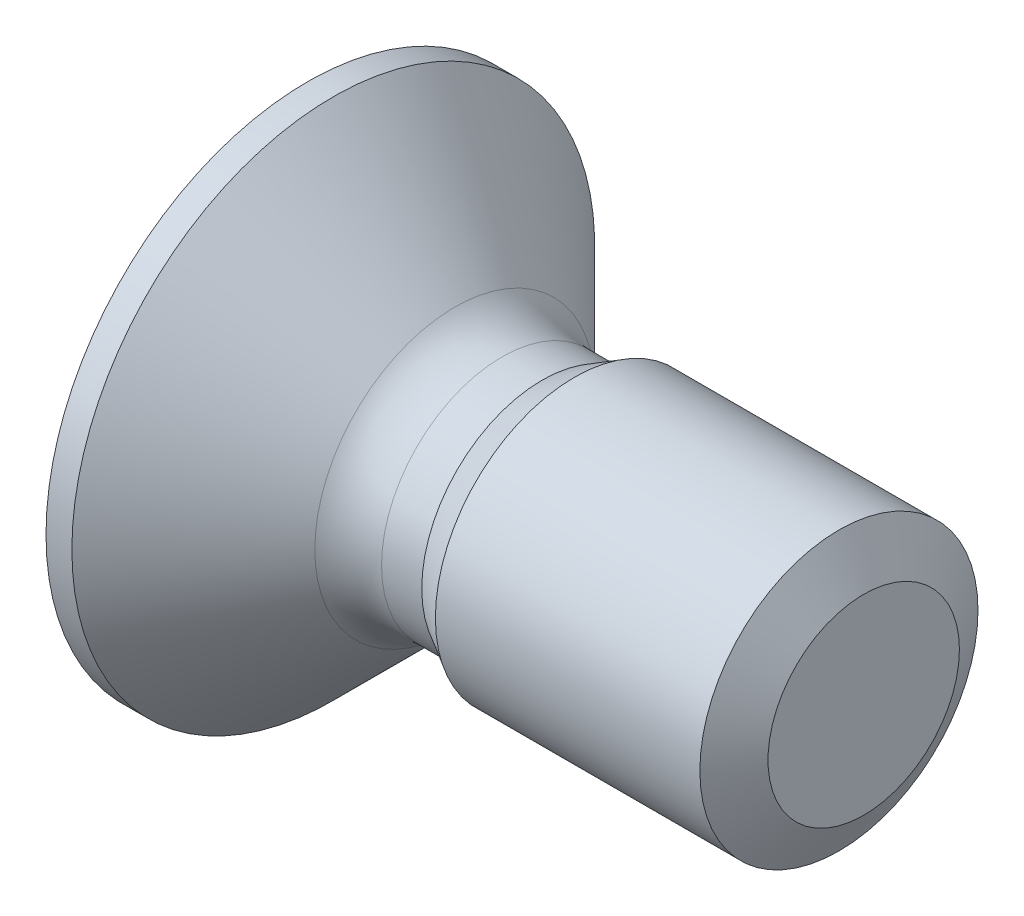
ISO-10303-21;
HEADER;
FILE_DESCRIPTION(('STEP AP214'),'2;1');
FILE_NAME('part.step','',(''),(''),'','','');
FILE_SCHEMA(('AUTOMOTIVE_DESIGN { 1 0 10303 214 1 1 1 1 }'));
ENDSEC;
DATA;
#1=APPLICATION_CONTEXT('core data for automotive mechanical design processes');
#2=APPLICATION_PROTOCOL_DEFINITION('international standard','automotive_design',2000,#1);
#3=PRODUCT_CONTEXT('',#1,'mechanical');
#4=PRODUCT('Part','Part','',(#3));
#5=PRODUCT_RELATED_PRODUCT_CATEGORY('part','',(#4));
#6=PRODUCT_DEFINITION_FORMATION('','',#4);
#7=PRODUCT_DEFINITION_CONTEXT('part definition',#1,'design');
#8=PRODUCT_DEFINITION('design','',#6,#7);
#9=PRODUCT_DEFINITION_SHAPE('','',#8);
#10=(LENGTH_UNIT() NAMED_UNIT(*) SI_UNIT(.MILLI.,.METRE.));
#11=(NAMED_UNIT(*) PLANE_ANGLE_UNIT() SI_UNIT($,.RADIAN.));
#12=(NAMED_UNIT(*) SI_UNIT($,.STERADIAN.) SOLID_ANGLE_UNIT());
#13=UNCERTAINTY_MEASURE_WITH_UNIT(LENGTH_MEASURE(1.E-05),#10,'distance_accuracy_value','');
#14=(GEOMETRIC_REPRESENTATION_CONTEXT(3) GLOBAL_UNCERTAINTY_ASSIGNED_CONTEXT((#13)) GLOBAL_UNIT_ASSIGNED_CONTEXT((#10,
#11,#12)) REPRESENTATION_CONTEXT('',''));
#15=CARTESIAN_POINT('',(0.,0.,0.));
#16=DIRECTION('',(0.,0.,1.));
#17=DIRECTION('',(1.,0.,0.));
#18=AXIS2_PLACEMENT_3D('',#15,#16,#17);
#19=CARTESIAN_POINT('',(0.,0.,0.));
#20=DIRECTION('',(1.,0.,0.));
#21=DIRECTION('',(0.,0.,-1.));
#22=AXIS2_PLACEMENT_3D('',#19,#20,#21);
#23=PLANE('',#22);
#24=CARTESIAN_POINT('',(0.,0.,0.));
#25=DIRECTION('',(-1.,0.,0.));
#26=DIRECTION('',(0.,0.,1.));
#27=AXIS2_PLACEMENT_3D('',#24,#25,#26);
#28=CIRCLE('',#27,2.35);
#29=CARTESIAN_POINT('',(0.,0.,2.35));
#30=VERTEX_POINT('',#29);
#31=EDGE_CURVE('E183',#30,#30,#28,.T.);
#32=ORIENTED_EDGE('',*,*,#31,.T.);
#33=EDGE_LOOP('',(#32));
#34=FACE_BOUND('',#33,.T.);
#35=DIRECTION('',(0.,1.,0.));
#36=VECTOR('',#35,1.);
#37=CARTESIAN_POINT('',(0.,1.45,0.225000000000005));
#38=LINE('',#37,#36);
#39=CARTESIAN_POINT('',(0.,0.225,0.225000000000001));
#40=VERTEX_POINT('',#39);
#41=CARTESIAN_POINT('',(0.,1.45,0.225000000000005));
#42=VERTEX_POINT('',#41);
#43=EDGE_CURVE('E105',#40,#42,#38,.T.);
#44=ORIENTED_EDGE('',*,*,#43,.F.);
#45=DIRECTION('',(0.,0.,-1.));
#46=VECTOR('',#45,1.);
#47=CARTESIAN_POINT('',(0.,0.225,-1.45));
#48=LINE('',#47,#46);
#49=CARTESIAN_POINT('',(0.,0.225,1.45));
#50=VERTEX_POINT('',#49);
#51=EDGE_CURVE('E150',#50,#40,#48,.T.);
#52=ORIENTED_EDGE('',*,*,#51,.F.);
#53=DIRECTION('',(0.,1.,0.));
#54=VECTOR('',#53,1.);
#55=CARTESIAN_POINT('',(0.,0.225,1.45));
#56=LINE('',#55,#54);
#57=CARTESIAN_POINT('',(0.,-0.225,1.45));
#58=VERTEX_POINT('',#57);
#59=EDGE_CURVE('E147',#58,#50,#56,.T.);
#60=ORIENTED_EDGE('',*,*,#59,.F.);
#61=DIRECTION('',(0.,0.,1.));
#62=VECTOR('',#61,1.);
#63=CARTESIAN_POINT('',(0.,-0.225,-1.45));
#64=LINE('',#63,#62);
#65=CARTESIAN_POINT('',(0.,-0.225,0.224999999999999));
#66=VERTEX_POINT('',#65);
#67=EDGE_CURVE('E78',#66,#58,#64,.T.);
#68=ORIENTED_EDGE('',*,*,#67,.F.);
#69=CARTESIAN_POINT('',(0.,-1.45,0.224999999999995));
#70=VERTEX_POINT('',#69);
#71=EDGE_CURVE('E113',#70,#66,#38,.T.);
#72=ORIENTED_EDGE('',*,*,#71,.F.);
#73=DIRECTION('',(0.,0.,1.));
#74=VECTOR('',#73,1.);
#75=CARTESIAN_POINT('',(0.,-1.45,0.224999999999995));
#76=LINE('',#75,#74);
#77=CARTESIAN_POINT('',(0.,-1.45,-0.225000000000005));
#78=VERTEX_POINT('',#77);
#79=EDGE_CURVE('E114',#78,#70,#76,.T.);
#80=ORIENTED_EDGE('',*,*,#79,.F.);
#81=DIRECTION('',(0.,-1.,0.));
#82=VECTOR('',#81,1.);
#83=CARTESIAN_POINT('',(0.,1.45,-0.224999999999995));
#84=LINE('',#83,#82);
#85=CARTESIAN_POINT('',(0.,-0.225,-0.225000000000001));
#86=VERTEX_POINT('',#85);
#87=EDGE_CURVE('E127',#86,#78,#84,.T.);
#88=ORIENTED_EDGE('',*,*,#87,.F.);
#89=CARTESIAN_POINT('',(0.,-0.225,-1.45));
#90=VERTEX_POINT('',#89);
#91=EDGE_CURVE('E144',#90,#86,#64,.T.);
#92=ORIENTED_EDGE('',*,*,#91,.F.);
#93=DIRECTION('',(0.,-1.,0.));
#94=VECTOR('',#93,1.);
#95=CARTESIAN_POINT('',(0.,0.225,-1.45));
#96=LINE('',#95,#94);
#97=CARTESIAN_POINT('',(0.,0.225,-1.45));
#98=VERTEX_POINT('',#97);
#99=EDGE_CURVE('E55',#98,#90,#96,.T.);
#100=ORIENTED_EDGE('',*,*,#99,.F.);
#101=CARTESIAN_POINT('',(0.,0.225,-0.224999999999999));
#102=VERTEX_POINT('',#101);
#103=EDGE_CURVE('E153',#102,#98,#48,.T.);
#104=ORIENTED_EDGE('',*,*,#103,.F.);
#105=CARTESIAN_POINT('',(0.,1.45,-0.224999999999995));
#106=VERTEX_POINT('',#105);
#107=EDGE_CURVE('E126',#106,#102,#84,.T.);
#108=ORIENTED_EDGE('',*,*,#107,.F.);
#109=DIRECTION('',(0.,0.,-1.));
#110=VECTOR('',#109,1.);
#111=CARTESIAN_POINT('',(0.,1.45,0.225000000000005));
#112=LINE('',#111,#110);
#113=EDGE_CURVE('E119',#42,#106,#112,.T.);
#114=ORIENTED_EDGE('',*,*,#113,.F.);
#115=EDGE_LOOP('',(#44,#52,#60,#68,#72,#80,#88,#92,#100,#104,#108,#114));
#116=FACE_BOUND('',#115,.T.);
#117=ADVANCED_FACE('F41',(#34,#116),#23,.F.);
#118=CARTESIAN_POINT('',(1.8,0.,0.));
#119=DIRECTION('',(-0.124034734589208,-0.992277876713668,0.));
#120=DIRECTION('',(0.992277876713668,-0.124034734589208,0.));
#121=AXIS2_PLACEMENT_3D('',#118,#119,#120);
#122=PLANE('',#121);
#123=ORIENTED_EDGE('',*,*,#51,.T.);
#124=DIRECTION('',(0.984731927834662,-0.123091490979333,-0.123091490979333));
#125=VECTOR('',#124,1.);
#126=CARTESIAN_POINT('',(1.8,0.,0.));
#127=LINE('',#126,#125);
#128=CARTESIAN_POINT('',(1.8,0.,0.));
#129=VERTEX_POINT('',#128);
#130=EDGE_CURVE('E84',#40,#129,#127,.T.);
#131=ORIENTED_EDGE('',*,*,#130,.T.);
#132=DIRECTION('',(0.775090228729781,-0.0968862785912226,-0.624378239810101));
#133=VECTOR('',#132,1.);
#134=CARTESIAN_POINT('',(0.,0.225,1.45));
#135=LINE('',#134,#133);
#136=EDGE_CURVE('E64',#50,#129,#135,.T.);
#137=ORIENTED_EDGE('',*,*,#136,.F.);
#138=EDGE_LOOP('',(#123,#131,#137));
#139=FACE_BOUND('',#138,.T.);
#140=ADVANCED_FACE('F199',(#139),#122,.T.);
#141=DIRECTION('',(0.775090228729781,-0.0968862785912226,0.624378239810101));
#142=VECTOR('',#141,1.);
#143=CARTESIAN_POINT('',(0.,0.225,-1.45));
#144=LINE('',#143,#142);
#145=EDGE_CURVE('E149',#98,#129,#144,.T.);
#146=ORIENTED_EDGE('',*,*,#145,.T.);
#147=DIRECTION('',(-0.984731927834662,0.123091490979333,-0.123091490979332));
#148=VECTOR('',#147,1.);
#149=CARTESIAN_POINT('',(1.8,0.,0.));
#150=LINE('',#149,#148);
#151=EDGE_CURVE('E131',#129,#102,#150,.T.);
#152=ORIENTED_EDGE('',*,*,#151,.T.);
#153=ORIENTED_EDGE('',*,*,#103,.T.);
#154=EDGE_LOOP('',(#146,#152,#153));
#155=FACE_BOUND('',#154,.T.);
#156=ADVANCED_FACE('F193',(#155),#122,.T.);
#157=CARTESIAN_POINT('',(1.8,0.,0.));
#158=DIRECTION('',(-0.124034734589208,0.992277876713668,0.));
#159=DIRECTION('',(-0.992277876713668,-0.124034734589208,0.));
#160=AXIS2_PLACEMENT_3D('',#157,#158,#159);
#161=PLANE('',#160);
#162=DIRECTION('',(0.775090228729781,0.0968862785912226,-0.624378239810101));
#163=VECTOR('',#162,1.);
#164=CARTESIAN_POINT('',(0.,-0.225,1.45));
#165=LINE('',#164,#163);
#166=EDGE_CURVE('E143',#58,#129,#165,.T.);
#167=ORIENTED_EDGE('',*,*,#166,.T.);
#168=DIRECTION('',(-0.984731927834662,-0.123091490979333,0.123091490979332));
#169=VECTOR('',#168,1.);
#170=CARTESIAN_POINT('',(1.8,0.,0.));
#171=LINE('',#170,#169);
#172=EDGE_CURVE('E11',#129,#66,#171,.T.);
#173=ORIENTED_EDGE('',*,*,#172,.T.);
#174=ORIENTED_EDGE('',*,*,#67,.T.);
#175=EDGE_LOOP('',(#167,#173,#174));
#176=FACE_BOUND('',#175,.T.);
#177=ADVANCED_FACE('F194',(#176),#161,.T.);
#178=ORIENTED_EDGE('',*,*,#91,.T.);
#179=DIRECTION('',(0.984731927834662,0.123091490979333,0.123091490979333));
#180=VECTOR('',#179,1.);
#181=CARTESIAN_POINT('',(1.8,0.,0.));
#182=LINE('',#181,#180);
#183=EDGE_CURVE('E48',#86,#129,#182,.T.);
#184=ORIENTED_EDGE('',*,*,#183,.T.);
#185=DIRECTION('',(0.775090228729781,0.0968862785912226,0.624378239810101));
#186=VECTOR('',#185,1.);
#187=CARTESIAN_POINT('',(0.,-0.225,-1.45));
#188=LINE('',#187,#186);
#189=EDGE_CURVE('E158',#90,#129,#188,.T.);
#190=ORIENTED_EDGE('',*,*,#189,.F.);
#191=EDGE_LOOP('',(#178,#184,#190));
#192=FACE_BOUND('',#191,.T.);
#193=ADVANCED_FACE('F187',(#192),#161,.T.);
#194=CARTESIAN_POINT('',(0.,0.,0.));
#195=DIRECTION('',(-1.,0.,0.));
#196=DIRECTION('',(0.,0.,1.));
#197=AXIS2_PLACEMENT_3D('',#194,#195,#196);
#198=CYLINDRICAL_SURFACE('',#197,2.35);
#199=ORIENTED_EDGE('',*,*,#31,.F.);
#200=EDGE_LOOP('',(#199));
#201=FACE_BOUND('',#200,.T.);
#202=CARTESIAN_POINT('',(0.232500000000005,0.,0.));
#203=DIRECTION('',(-1.,0.,0.));
#204=DIRECTION('',(0.,0.,1.));
#205=AXIS2_PLACEMENT_3D('',#202,#203,#204);
#206=CIRCLE('',#205,2.35);
#207=CARTESIAN_POINT('',(0.232500000000005,0.,2.35));
#208=VERTEX_POINT('',#207);
#209=EDGE_CURVE('E179',#208,#208,#206,.T.);
#210=ORIENTED_EDGE('',*,*,#209,.T.);
#211=EDGE_LOOP('',(#210));
#212=FACE_BOUND('',#211,.T.);
#213=ADVANCED_FACE('F227',(#201,#212),#198,.T.);
#214=CARTESIAN_POINT('',(1.32426406871193,0.,0.));
#215=DIRECTION('',(-1.,0.,0.));
#216=DIRECTION('',(0.,0.,1.));
#217=AXIS2_PLACEMENT_3D('',#214,#215,#216);
#218=CONICAL_SURFACE('',#217,1.25823593128807,0.78539816339745);
#219=ORIENTED_EDGE('',*,*,#209,.F.);
#220=EDGE_LOOP('',(#219));
#221=FACE_BOUND('',#220,.T.);
#222=CARTESIAN_POINT('',(1.32426406871193,0.,0.));
#223=DIRECTION('',(-1.,0.,0.));
#224=DIRECTION('',(0.,0.,1.));
#225=AXIS2_PLACEMENT_3D('',#222,#223,#224);
#226=CIRCLE('',#225,1.25823593128807);
#227=CARTESIAN_POINT('',(1.32426406871193,0.,1.25823593128807));
#228=VERTEX_POINT('',#227);
#229=EDGE_CURVE('E175',#228,#228,#226,.T.);
#230=ORIENTED_EDGE('',*,*,#229,.T.);
#231=EDGE_LOOP('',(#230));
#232=FACE_BOUND('',#231,.T.);
#233=ADVANCED_FACE('F230',(#221,#232),#218,.T.);
#234=CARTESIAN_POINT('',(1.74852813742386,0.,0.));
#235=DIRECTION('',(-1.,0.,0.));
#236=DIRECTION('',(0.,0.,1.));
#237=AXIS2_PLACEMENT_3D('',#234,#235,#236);
#238=TOROIDAL_SURFACE('',#237,1.6825,0.6);
#239=ORIENTED_EDGE('',*,*,#229,.F.);
#240=EDGE_LOOP('',(#239));
#241=FACE_BOUND('',#240,.T.);
#242=CARTESIAN_POINT('',(1.74852813742386,0.,0.));
#243=DIRECTION('',(-1.,0.,0.));
#244=DIRECTION('',(0.,0.,1.));
#245=AXIS2_PLACEMENT_3D('',#242,#243,#244);
#246=CIRCLE('',#245,1.0825);
#247=CARTESIAN_POINT('',(1.74852813742386,0.,1.0825));
#248=VERTEX_POINT('',#247);
#249=EDGE_CURVE('E172',#248,#248,#246,.T.);
#250=ORIENTED_EDGE('',*,*,#249,.T.);
#251=EDGE_LOOP('',(#250));
#252=FACE_BOUND('',#251,.T.);
#253=ADVANCED_FACE('F235',(#241,#252),#238,.F.);
#254=CARTESIAN_POINT('',(0.,0.,0.));
#255=DIRECTION('',(-1.,0.,0.));
#256=DIRECTION('',(0.,0.,1.));
#257=AXIS2_PLACEMENT_3D('',#254,#255,#256);
#258=CYLINDRICAL_SURFACE('',#257,1.0825);
#259=ORIENTED_EDGE('',*,*,#249,.F.);
#260=EDGE_LOOP('',(#259));
#261=FACE_BOUND('',#260,.T.);
#262=CARTESIAN_POINT('',(2.10988148973221,0.,0.));
#263=DIRECTION('',(-1.,0.,0.));
#264=DIRECTION('',(0.,0.,1.));
#265=AXIS2_PLACEMENT_3D('',#262,#263,#264);
#266=CIRCLE('',#265,1.0825);
#267=CARTESIAN_POINT('',(2.10988148973221,0.,1.0825));
#268=VERTEX_POINT('',#267);
#269=EDGE_CURVE('E169',#268,#268,#266,.T.);
#270=ORIENTED_EDGE('',*,*,#269,.T.);
#271=EDGE_LOOP('',(#270));
#272=FACE_BOUND('',#271,.T.);
#273=ADVANCED_FACE('F241',(#261,#272),#258,.T.);
#274=CARTESIAN_POINT('',(2.4,0.,0.));
#275=DIRECTION('',(1.,0.,0.));
#276=DIRECTION('',(0.,0.,-1.));
#277=AXIS2_PLACEMENT_3D('',#274,#275,#276);
#278=CONICAL_SURFACE('',#277,1.25,0.5235987755983);
#279=ORIENTED_EDGE('',*,*,#269,.F.);
#280=EDGE_LOOP('',(#279));
#281=FACE_BOUND('',#280,.T.);
#282=CARTESIAN_POINT('',(2.4,0.,0.));
#283=DIRECTION('',(-1.,0.,0.));
#284=DIRECTION('',(0.,0.,1.));
#285=AXIS2_PLACEMENT_3D('',#282,#283,#284);
#286=CIRCLE('',#285,1.25);
#287=CARTESIAN_POINT('',(2.4,0.,1.25));
#288=VERTEX_POINT('',#287);
#289=EDGE_CURVE('E166',#288,#288,#286,.T.);
#290=ORIENTED_EDGE('',*,*,#289,.T.);
#291=EDGE_LOOP('',(#290));
#292=FACE_BOUND('',#291,.T.);
#293=ADVANCED_FACE('F247',(#281,#292),#278,.T.);
#294=CARTESIAN_POINT('',(0.,0.,0.));
#295=DIRECTION('',(-1.,0.,0.));
#296=DIRECTION('',(0.,0.,1.));
#297=AXIS2_PLACEMENT_3D('',#294,#295,#296);
#298=CYLINDRICAL_SURFACE('',#297,1.25);
#299=CARTESIAN_POINT('',(4.77743720258411,0.,0.));
#300=DIRECTION('',(1.,0.,0.));
#301=DIRECTION('',(0.,0.,-1.));
#302=AXIS2_PLACEMENT_3D('',#299,#300,#301);
#303=CIRCLE('',#302,1.25);
#304=CARTESIAN_POINT('',(4.77743720258411,0.,-1.25));
#305=VERTEX_POINT('',#304);
#306=EDGE_CURVE('E163',#305,#305,#303,.T.);
#307=ORIENTED_EDGE('',*,*,#306,.F.);
#308=EDGE_LOOP('',(#307));
#309=FACE_BOUND('',#308,.T.);
#310=ORIENTED_EDGE('',*,*,#289,.F.);
#311=EDGE_LOOP('',(#310));
#312=FACE_BOUND('',#311,.T.);
#313=ADVANCED_FACE('F253',(#309,#312),#298,.T.);
#314=CARTESIAN_POINT('',(4.77743720258411,0.,0.));
#315=DIRECTION('',(-1.,0.,0.));
#316=DIRECTION('',(0.,0.,1.));
#317=AXIS2_PLACEMENT_3D('',#314,#315,#316);
#318=CONICAL_SURFACE('',#317,1.25,1.05188801855134);
#319=CARTESIAN_POINT('',(5.,0.,0.));
#320=DIRECTION('',(1.,0.,0.));
#321=DIRECTION('',(0.,0.,-1.));
#322=AXIS2_PLACEMENT_3D('',#319,#320,#321);
#323=CIRCLE('',#322,0.8603);
#324=CARTESIAN_POINT('',(5.,0.,-0.8603));
#325=VERTEX_POINT('',#324);
#326=EDGE_CURVE('E152',#325,#325,#323,.T.);
#327=ORIENTED_EDGE('',*,*,#326,.F.);
#328=EDGE_LOOP('',(#327));
#329=FACE_BOUND('',#328,.T.);
#330=ORIENTED_EDGE('',*,*,#306,.T.);
#331=EDGE_LOOP('',(#330));
#332=FACE_BOUND('',#331,.T.);
#333=ADVANCED_FACE('F258',(#329,#332),#318,.T.);
#334=CARTESIAN_POINT('',(5.,1.25,0.));
#335=DIRECTION('',(-1.,0.,0.));
#336=DIRECTION('',(0.,0.,1.));
#337=AXIS2_PLACEMENT_3D('',#334,#335,#336);
#338=PLANE('',#337);
#339=ORIENTED_EDGE('',*,*,#326,.T.);
#340=EDGE_LOOP('',(#339));
#341=FACE_BOUND('',#340,.T.);
#342=ADVANCED_FACE('F264',(#341),#338,.F.);
#343=CARTESIAN_POINT('',(0.,0.225,-1.45));
#344=DIRECTION('',(0.627329537872645,0.,-0.778753909083283));
#345=DIRECTION('',(-0.778753909083283,0.,-0.627329537872645));
#346=AXIS2_PLACEMENT_3D('',#343,#344,#345);
#347=PLANE('',#346);
#348=ORIENTED_EDGE('',*,*,#145,.F.);
#349=ORIENTED_EDGE('',*,*,#99,.T.);
#350=ORIENTED_EDGE('',*,*,#189,.T.);
#351=EDGE_LOOP('',(#348,#349,#350));
#352=FACE_BOUND('',#351,.T.);
#353=ADVANCED_FACE('F191',(#352),#347,.F.);
#354=CARTESIAN_POINT('',(0.,-0.225,1.45));
#355=DIRECTION('',(0.627329537872645,0.,0.778753909083283));
#356=DIRECTION('',(0.778753909083283,0.,-0.627329537872645));
#357=AXIS2_PLACEMENT_3D('',#354,#355,#356);
#358=PLANE('',#357);
#359=ORIENTED_EDGE('',*,*,#166,.F.);
#360=ORIENTED_EDGE('',*,*,#59,.T.);
#361=ORIENTED_EDGE('',*,*,#136,.T.);
#362=EDGE_LOOP('',(#359,#360,#361));
#363=FACE_BOUND('',#362,.T.);
#364=ADVANCED_FACE('F198',(#363),#358,.F.);
#365=CARTESIAN_POINT('',(1.8,0.,0.));
#366=DIRECTION('',(-0.124034734589208,0.,-0.992277876713668));
#367=DIRECTION('',(0.992277876713668,0.,-0.124034734589208));
#368=AXIS2_PLACEMENT_3D('',#365,#366,#367);
#369=PLANE('',#368);
#370=DIRECTION('',(0.775090228729781,0.624378239810101,-0.0968862785912204));
#371=VECTOR('',#370,1.);
#372=CARTESIAN_POINT('',(0.,-1.45,0.224999999999995));
#373=LINE('',#372,#371);
#374=EDGE_CURVE('E123',#70,#129,#373,.T.);
#375=ORIENTED_EDGE('',*,*,#374,.F.);
#376=ORIENTED_EDGE('',*,*,#71,.T.);
#377=ORIENTED_EDGE('',*,*,#172,.F.);
#378=EDGE_LOOP('',(#375,#376,#377));
#379=FACE_BOUND('',#378,.T.);
#380=ADVANCED_FACE('F203',(#379),#369,.T.);
#381=CARTESIAN_POINT('',(1.8,0.,0.));
#382=DIRECTION('',(-0.124034734589208,0.,0.992277876713668));
#383=DIRECTION('',(-0.992277876713668,0.,-0.124034734589208));
#384=AXIS2_PLACEMENT_3D('',#381,#382,#383);
#385=PLANE('',#384);
#386=ORIENTED_EDGE('',*,*,#87,.T.);
#387=DIRECTION('',(0.775090228729781,0.624378239810101,0.0968862785912248));
#388=VECTOR('',#387,1.);
#389=CARTESIAN_POINT('',(0.,-1.45,-0.225000000000005));
#390=LINE('',#389,#388);
#391=EDGE_CURVE('E137',#78,#129,#390,.T.);
#392=ORIENTED_EDGE('',*,*,#391,.T.);
#393=ORIENTED_EDGE('',*,*,#183,.F.);
#394=EDGE_LOOP('',(#386,#392,#393));
#395=FACE_BOUND('',#394,.T.);
#396=ADVANCED_FACE('F207',(#395),#385,.T.);
#397=CARTESIAN_POINT('',(0.,-1.45,-0.225000000000005));
#398=DIRECTION('',(0.627329537872645,-0.778753909083283,0.));
#399=DIRECTION('',(0.778753909083283,0.627329537872645,0.));
#400=AXIS2_PLACEMENT_3D('',#397,#398,#399);
#401=PLANE('',#400);
#402=ORIENTED_EDGE('',*,*,#391,.F.);
#403=ORIENTED_EDGE('',*,*,#79,.T.);
#404=ORIENTED_EDGE('',*,*,#374,.T.);
#405=EDGE_LOOP('',(#402,#403,#404));
#406=FACE_BOUND('',#405,.T.);
#407=ADVANCED_FACE('F206',(#406),#401,.F.);
#408=ORIENTED_EDGE('',*,*,#43,.T.);
#409=DIRECTION('',(0.775090228729781,-0.624378239810101,-0.0968862785912248));
#410=VECTOR('',#409,1.);
#411=CARTESIAN_POINT('',(0.,1.45,0.225000000000005));
#412=LINE('',#411,#410);
#413=EDGE_CURVE('E108',#42,#129,#412,.T.);
#414=ORIENTED_EDGE('',*,*,#413,.T.);
#415=ORIENTED_EDGE('',*,*,#130,.F.);
#416=EDGE_LOOP('',(#408,#414,#415));
#417=FACE_BOUND('',#416,.T.);
#418=ADVANCED_FACE('F107',(#417),#369,.T.);
#419=DIRECTION('',(0.775090228729781,-0.624378239810101,0.0968862785912204));
#420=VECTOR('',#419,1.);
#421=CARTESIAN_POINT('',(0.,1.45,-0.224999999999995));
#422=LINE('',#421,#420);
#423=EDGE_CURVE('E121',#106,#129,#422,.T.);
#424=ORIENTED_EDGE('',*,*,#423,.F.);
#425=ORIENTED_EDGE('',*,*,#107,.T.);
#426=ORIENTED_EDGE('',*,*,#151,.F.);
#427=EDGE_LOOP('',(#424,#425,#426));
#428=FACE_BOUND('',#427,.T.);
#429=ADVANCED_FACE('F210',(#428),#385,.T.);
#430=CARTESIAN_POINT('',(0.,1.45,0.225000000000005));
#431=DIRECTION('',(0.627329537872645,0.778753909083283,0.));
#432=DIRECTION('',(-0.778753909083283,0.627329537872645,0.));
#433=AXIS2_PLACEMENT_3D('',#430,#431,#432);
#434=PLANE('',#433);
#435=ORIENTED_EDGE('',*,*,#413,.F.);
#436=ORIENTED_EDGE('',*,*,#113,.T.);
#437=ORIENTED_EDGE('',*,*,#423,.T.);
#438=EDGE_LOOP('',(#435,#436,#437));
#439=FACE_BOUND('',#438,.T.);
#440=ADVANCED_FACE('F118',(#439),#434,.F.);
#441=CLOSED_SHELL('',(#117,#140,#156,#177,#193,#213,#233,#253,#273,#293,#313,#333,#342,#353,
#364,#380,#396,#407,#418,#429,#440));
#442=MANIFOLD_SOLID_BREP('B2',#441);
#443=ADVANCED_BREP_SHAPE_REPRESENTATION('',(#18,#442),#14);
#444=SHAPE_DEFINITION_REPRESENTATION(#9,#443);
ENDSEC;
END-ISO-10303-21;
